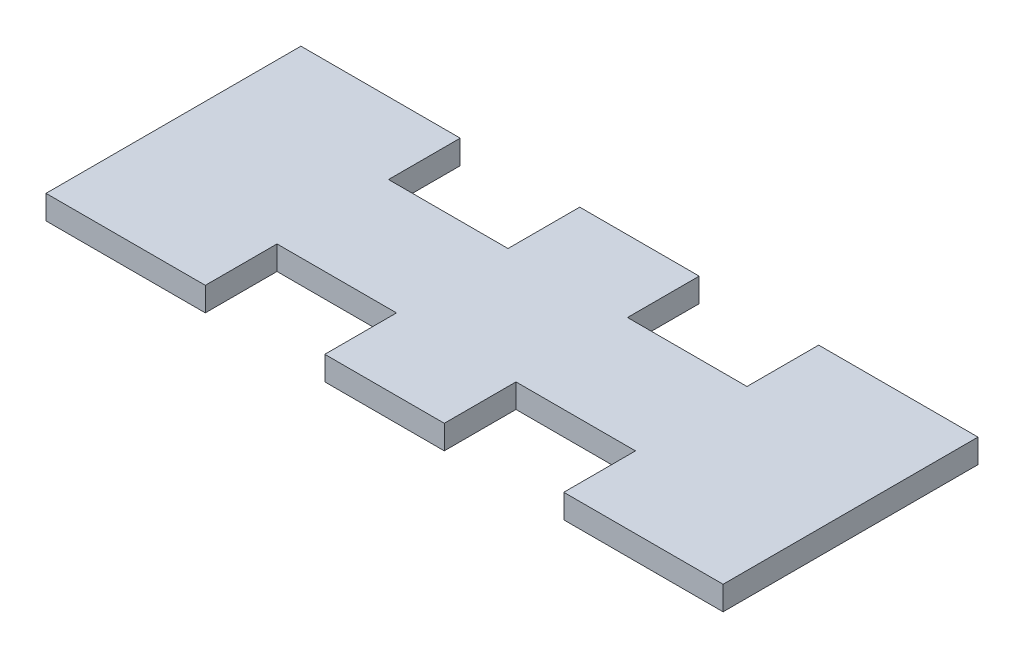
ISO-10303-21;
HEADER;
FILE_DESCRIPTION(('STEP AP214'),'2;1');
FILE_NAME('part.step','',(''),(''),'','','');
FILE_SCHEMA(('AUTOMOTIVE_DESIGN { 1 0 10303 214 1 1 1 1 }'));
ENDSEC;
DATA;
#1=APPLICATION_CONTEXT('core data for automotive mechanical design processes');
#2=APPLICATION_PROTOCOL_DEFINITION('international standard','automotive_design',2000,#1);
#3=PRODUCT_CONTEXT('',#1,'mechanical');
#4=PRODUCT('Part','Part','',(#3));
#5=PRODUCT_RELATED_PRODUCT_CATEGORY('part','',(#4));
#6=PRODUCT_DEFINITION_FORMATION('','',#4);
#7=PRODUCT_DEFINITION_CONTEXT('part definition',#1,'design');
#8=PRODUCT_DEFINITION('design','',#6,#7);
#9=PRODUCT_DEFINITION_SHAPE('','',#8);
#10=(LENGTH_UNIT() NAMED_UNIT(*) SI_UNIT(.MILLI.,.METRE.));
#11=(NAMED_UNIT(*) PLANE_ANGLE_UNIT() SI_UNIT($,.RADIAN.));
#12=(NAMED_UNIT(*) SI_UNIT($,.STERADIAN.) SOLID_ANGLE_UNIT());
#13=UNCERTAINTY_MEASURE_WITH_UNIT(LENGTH_MEASURE(1.E-05),#10,'distance_accuracy_value','');
#14=(GEOMETRIC_REPRESENTATION_CONTEXT(3) GLOBAL_UNCERTAINTY_ASSIGNED_CONTEXT((#13)) GLOBAL_UNIT_ASSIGNED_CONTEXT((#10,
#11,#12)) REPRESENTATION_CONTEXT('',''));
#15=CARTESIAN_POINT('',(0.,0.,0.));
#16=DIRECTION('',(0.,0.,1.));
#17=DIRECTION('',(1.,0.,0.));
#18=AXIS2_PLACEMENT_3D('',#15,#16,#17);
#19=CARTESIAN_POINT('',(0.,3.,0.));
#20=DIRECTION('',(1.,0.,0.));
#21=DIRECTION('',(0.,0.,-1.));
#22=AXIS2_PLACEMENT_3D('',#19,#20,#21);
#23=PLANE('',#22);
#24=DIRECTION('',(0.,0.,1.));
#25=VECTOR('',#24,1.);
#26=CARTESIAN_POINT('',(0.,0.,0.));
#27=LINE('',#26,#25);
#28=CARTESIAN_POINT('',(0.,0.,-32.));
#29=VERTEX_POINT('',#28);
#30=CARTESIAN_POINT('',(0.,0.,0.));
#31=VERTEX_POINT('',#30);
#32=EDGE_CURVE('E201',#29,#31,#27,.T.);
#33=ORIENTED_EDGE('',*,*,#32,.T.);
#34=DIRECTION('',(0.,-1.,0.));
#35=VECTOR('',#34,1.);
#36=CARTESIAN_POINT('',(0.,3.,0.));
#37=LINE('',#36,#35);
#38=CARTESIAN_POINT('',(0.,3.,0.));
#39=VERTEX_POINT('',#38);
#40=EDGE_CURVE('E11',#39,#31,#37,.T.);
#41=ORIENTED_EDGE('',*,*,#40,.F.);
#42=DIRECTION('',(0.,0.,1.));
#43=VECTOR('',#42,1.);
#44=CARTESIAN_POINT('',(0.,3.,0.));
#45=LINE('',#44,#43);
#46=CARTESIAN_POINT('',(0.,3.,-32.));
#47=VERTEX_POINT('',#46);
#48=EDGE_CURVE('E239',#47,#39,#45,.T.);
#49=ORIENTED_EDGE('',*,*,#48,.F.);
#50=DIRECTION('',(0.,-1.,0.));
#51=VECTOR('',#50,1.);
#52=CARTESIAN_POINT('',(0.,3.,-32.));
#53=LINE('',#52,#51);
#54=EDGE_CURVE('E197',#47,#29,#53,.T.);
#55=ORIENTED_EDGE('',*,*,#54,.T.);
#56=EDGE_LOOP('',(#33,#41,#49,#55));
#57=FACE_BOUND('',#56,.T.);
#58=ADVANCED_FACE('F33',(#57),#23,.F.);
#59=CARTESIAN_POINT('',(0.,3.,0.));
#60=DIRECTION('',(0.,0.,-1.));
#61=DIRECTION('',(-1.,0.,0.));
#62=AXIS2_PLACEMENT_3D('',#59,#60,#61);
#63=PLANE('',#62);
#64=DIRECTION('',(1.,0.,0.));
#65=VECTOR('',#64,1.);
#66=CARTESIAN_POINT('',(0.,0.,0.));
#67=LINE('',#66,#65);
#68=CARTESIAN_POINT('',(20.,0.,0.));
#69=VERTEX_POINT('',#68);
#70=EDGE_CURVE('E204',#31,#69,#67,.T.);
#71=ORIENTED_EDGE('',*,*,#70,.T.);
#72=DIRECTION('',(0.,-1.,0.));
#73=VECTOR('',#72,1.);
#74=CARTESIAN_POINT('',(20.,3.,0.));
#75=LINE('',#74,#73);
#76=CARTESIAN_POINT('',(20.,3.,0.));
#77=VERTEX_POINT('',#76);
#78=EDGE_CURVE('E41',#77,#69,#75,.T.);
#79=ORIENTED_EDGE('',*,*,#78,.F.);
#80=DIRECTION('',(1.,0.,0.));
#81=VECTOR('',#80,1.);
#82=CARTESIAN_POINT('',(0.,3.,0.));
#83=LINE('',#82,#81);
#84=EDGE_CURVE('E128',#39,#77,#83,.T.);
#85=ORIENTED_EDGE('',*,*,#84,.F.);
#86=ORIENTED_EDGE('',*,*,#40,.T.);
#87=EDGE_LOOP('',(#71,#79,#85,#86));
#88=FACE_BOUND('',#87,.T.);
#89=ADVANCED_FACE('F357',(#88),#63,.F.);
#90=CARTESIAN_POINT('',(20.,3.,0.));
#91=DIRECTION('',(-1.,0.,0.));
#92=DIRECTION('',(0.,0.,1.));
#93=AXIS2_PLACEMENT_3D('',#90,#91,#92);
#94=PLANE('',#93);
#95=DIRECTION('',(0.,0.,-1.));
#96=VECTOR('',#95,1.);
#97=CARTESIAN_POINT('',(20.,0.,0.));
#98=LINE('',#97,#96);
#99=CARTESIAN_POINT('',(20.,0.,-9.));
#100=VERTEX_POINT('',#99);
#101=EDGE_CURVE('E206',#69,#100,#98,.T.);
#102=ORIENTED_EDGE('',*,*,#101,.T.);
#103=DIRECTION('',(0.,-1.,0.));
#104=VECTOR('',#103,1.);
#105=CARTESIAN_POINT('',(20.,3.,-9.));
#106=LINE('',#105,#104);
#107=CARTESIAN_POINT('',(20.,3.,-9.));
#108=VERTEX_POINT('',#107);
#109=EDGE_CURVE('E282',#108,#100,#106,.T.);
#110=ORIENTED_EDGE('',*,*,#109,.F.);
#111=DIRECTION('',(0.,0.,-1.));
#112=VECTOR('',#111,1.);
#113=CARTESIAN_POINT('',(20.,3.,0.));
#114=LINE('',#113,#112);
#115=EDGE_CURVE('E290',#77,#108,#114,.T.);
#116=ORIENTED_EDGE('',*,*,#115,.F.);
#117=ORIENTED_EDGE('',*,*,#78,.T.);
#118=EDGE_LOOP('',(#102,#110,#116,#117));
#119=FACE_BOUND('',#118,.T.);
#120=ADVANCED_FACE('F288',(#119),#94,.F.);
#121=CARTESIAN_POINT('',(20.,3.,-9.));
#122=DIRECTION('',(0.,0.,-1.));
#123=DIRECTION('',(-1.,0.,0.));
#124=AXIS2_PLACEMENT_3D('',#121,#122,#123);
#125=PLANE('',#124);
#126=DIRECTION('',(1.,0.,0.));
#127=VECTOR('',#126,1.);
#128=CARTESIAN_POINT('',(20.,0.,-9.));
#129=LINE('',#128,#127);
#130=CARTESIAN_POINT('',(35.,0.,-9.));
#131=VERTEX_POINT('',#130);
#132=EDGE_CURVE('E208',#100,#131,#129,.T.);
#133=ORIENTED_EDGE('',*,*,#132,.T.);
#134=DIRECTION('',(0.,-1.,0.));
#135=VECTOR('',#134,1.);
#136=CARTESIAN_POINT('',(35.,3.,-9.));
#137=LINE('',#136,#135);
#138=CARTESIAN_POINT('',(35.,3.,-9.));
#139=VERTEX_POINT('',#138);
#140=EDGE_CURVE('E279',#139,#131,#137,.T.);
#141=ORIENTED_EDGE('',*,*,#140,.F.);
#142=DIRECTION('',(1.,0.,0.));
#143=VECTOR('',#142,1.);
#144=CARTESIAN_POINT('',(20.,3.,-9.));
#145=LINE('',#144,#143);
#146=EDGE_CURVE('E308',#108,#139,#145,.T.);
#147=ORIENTED_EDGE('',*,*,#146,.F.);
#148=ORIENTED_EDGE('',*,*,#109,.T.);
#149=EDGE_LOOP('',(#133,#141,#147,#148));
#150=FACE_BOUND('',#149,.T.);
#151=ADVANCED_FACE('F299',(#150),#125,.F.);
#152=CARTESIAN_POINT('',(35.,3.,-9.));
#153=DIRECTION('',(1.,0.,0.));
#154=DIRECTION('',(0.,0.,-1.));
#155=AXIS2_PLACEMENT_3D('',#152,#153,#154);
#156=PLANE('',#155);
#157=DIRECTION('',(0.,0.,1.));
#158=VECTOR('',#157,1.);
#159=CARTESIAN_POINT('',(35.,0.,-9.));
#160=LINE('',#159,#158);
#161=CARTESIAN_POINT('',(35.,0.,0.));
#162=VERTEX_POINT('',#161);
#163=EDGE_CURVE('E210',#131,#162,#160,.T.);
#164=ORIENTED_EDGE('',*,*,#163,.T.);
#165=DIRECTION('',(0.,-1.,0.));
#166=VECTOR('',#165,1.);
#167=CARTESIAN_POINT('',(35.,3.,0.));
#168=LINE('',#167,#166);
#169=CARTESIAN_POINT('',(35.,3.,0.));
#170=VERTEX_POINT('',#169);
#171=EDGE_CURVE('E276',#170,#162,#168,.T.);
#172=ORIENTED_EDGE('',*,*,#171,.F.);
#173=DIRECTION('',(0.,0.,1.));
#174=VECTOR('',#173,1.);
#175=CARTESIAN_POINT('',(35.,3.,-9.));
#176=LINE('',#175,#174);
#177=EDGE_CURVE('E305',#139,#170,#176,.T.);
#178=ORIENTED_EDGE('',*,*,#177,.F.);
#179=ORIENTED_EDGE('',*,*,#140,.T.);
#180=EDGE_LOOP('',(#164,#172,#178,#179));
#181=FACE_BOUND('',#180,.T.);
#182=ADVANCED_FACE('F303',(#181),#156,.F.);
#183=CARTESIAN_POINT('',(35.,3.,0.));
#184=DIRECTION('',(0.,0.,-1.));
#185=DIRECTION('',(-1.,0.,0.));
#186=AXIS2_PLACEMENT_3D('',#183,#184,#185);
#187=PLANE('',#186);
#188=DIRECTION('',(1.,0.,0.));
#189=VECTOR('',#188,1.);
#190=CARTESIAN_POINT('',(35.,0.,0.));
#191=LINE('',#190,#189);
#192=CARTESIAN_POINT('',(50.,0.,0.));
#193=VERTEX_POINT('',#192);
#194=EDGE_CURVE('E212',#162,#193,#191,.T.);
#195=ORIENTED_EDGE('',*,*,#194,.T.);
#196=DIRECTION('',(0.,-1.,0.));
#197=VECTOR('',#196,1.);
#198=CARTESIAN_POINT('',(50.,3.,0.));
#199=LINE('',#198,#197);
#200=CARTESIAN_POINT('',(50.,3.,0.));
#201=VERTEX_POINT('',#200);
#202=EDGE_CURVE('E273',#201,#193,#199,.T.);
#203=ORIENTED_EDGE('',*,*,#202,.F.);
#204=DIRECTION('',(1.,0.,0.));
#205=VECTOR('',#204,1.);
#206=CARTESIAN_POINT('',(35.,3.,0.));
#207=LINE('',#206,#205);
#208=EDGE_CURVE('E307',#170,#201,#207,.T.);
#209=ORIENTED_EDGE('',*,*,#208,.F.);
#210=ORIENTED_EDGE('',*,*,#171,.T.);
#211=EDGE_LOOP('',(#195,#203,#209,#210));
#212=FACE_BOUND('',#211,.T.);
#213=ADVANCED_FACE('F370',(#212),#187,.F.);
#214=CARTESIAN_POINT('',(50.,3.,-9.));
#215=DIRECTION('',(-1.,0.,0.));
#216=DIRECTION('',(0.,0.,1.));
#217=AXIS2_PLACEMENT_3D('',#214,#215,#216);
#218=PLANE('',#217);
#219=DIRECTION('',(0.,0.,-1.));
#220=VECTOR('',#219,1.);
#221=CARTESIAN_POINT('',(50.,0.,-9.));
#222=LINE('',#221,#220);
#223=CARTESIAN_POINT('',(50.,0.,-9.));
#224=VERTEX_POINT('',#223);
#225=EDGE_CURVE('E214',#193,#224,#222,.T.);
#226=ORIENTED_EDGE('',*,*,#225,.T.);
#227=DIRECTION('',(0.,-1.,0.));
#228=VECTOR('',#227,1.);
#229=CARTESIAN_POINT('',(50.,3.,-9.));
#230=LINE('',#229,#228);
#231=CARTESIAN_POINT('',(50.,3.,-9.));
#232=VERTEX_POINT('',#231);
#233=EDGE_CURVE('E270',#232,#224,#230,.T.);
#234=ORIENTED_EDGE('',*,*,#233,.F.);
#235=DIRECTION('',(0.,0.,-1.));
#236=VECTOR('',#235,1.);
#237=CARTESIAN_POINT('',(50.,3.,-9.));
#238=LINE('',#237,#236);
#239=EDGE_CURVE('E310',#201,#232,#238,.T.);
#240=ORIENTED_EDGE('',*,*,#239,.F.);
#241=ORIENTED_EDGE('',*,*,#202,.T.);
#242=EDGE_LOOP('',(#226,#234,#240,#241));
#243=FACE_BOUND('',#242,.T.);
#244=ADVANCED_FACE('F373',(#243),#218,.F.);
#245=CARTESIAN_POINT('',(65.,3.,-9.));
#246=DIRECTION('',(0.,0.,-1.));
#247=DIRECTION('',(-1.,0.,0.));
#248=AXIS2_PLACEMENT_3D('',#245,#246,#247);
#249=PLANE('',#248);
#250=DIRECTION('',(1.,0.,0.));
#251=VECTOR('',#250,1.);
#252=CARTESIAN_POINT('',(65.,0.,-9.));
#253=LINE('',#252,#251);
#254=CARTESIAN_POINT('',(65.,0.,-9.));
#255=VERTEX_POINT('',#254);
#256=EDGE_CURVE('E216',#224,#255,#253,.T.);
#257=ORIENTED_EDGE('',*,*,#256,.T.);
#258=DIRECTION('',(0.,-1.,0.));
#259=VECTOR('',#258,1.);
#260=CARTESIAN_POINT('',(65.,3.,-9.));
#261=LINE('',#260,#259);
#262=CARTESIAN_POINT('',(65.,3.,-9.));
#263=VERTEX_POINT('',#262);
#264=EDGE_CURVE('E267',#263,#255,#261,.T.);
#265=ORIENTED_EDGE('',*,*,#264,.F.);
#266=DIRECTION('',(1.,0.,0.));
#267=VECTOR('',#266,1.);
#268=CARTESIAN_POINT('',(65.,3.,-9.));
#269=LINE('',#268,#267);
#270=EDGE_CURVE('E316',#232,#263,#269,.T.);
#271=ORIENTED_EDGE('',*,*,#270,.F.);
#272=ORIENTED_EDGE('',*,*,#233,.T.);
#273=EDGE_LOOP('',(#257,#265,#271,#272));
#274=FACE_BOUND('',#273,.T.);
#275=ADVANCED_FACE('F377',(#274),#249,.F.);
#276=CARTESIAN_POINT('',(65.,3.,0.));
#277=DIRECTION('',(1.,0.,0.));
#278=DIRECTION('',(0.,0.,-1.));
#279=AXIS2_PLACEMENT_3D('',#276,#277,#278);
#280=PLANE('',#279);
#281=DIRECTION('',(0.,0.,1.));
#282=VECTOR('',#281,1.);
#283=CARTESIAN_POINT('',(65.,0.,0.));
#284=LINE('',#283,#282);
#285=CARTESIAN_POINT('',(65.,0.,0.));
#286=VERTEX_POINT('',#285);
#287=EDGE_CURVE('E218',#255,#286,#284,.T.);
#288=ORIENTED_EDGE('',*,*,#287,.T.);
#289=DIRECTION('',(0.,-1.,0.));
#290=VECTOR('',#289,1.);
#291=CARTESIAN_POINT('',(65.,3.,0.));
#292=LINE('',#291,#290);
#293=CARTESIAN_POINT('',(65.,3.,0.));
#294=VERTEX_POINT('',#293);
#295=EDGE_CURVE('E264',#294,#286,#292,.T.);
#296=ORIENTED_EDGE('',*,*,#295,.F.);
#297=DIRECTION('',(0.,0.,1.));
#298=VECTOR('',#297,1.);
#299=CARTESIAN_POINT('',(65.,3.,0.));
#300=LINE('',#299,#298);
#301=EDGE_CURVE('E318',#263,#294,#300,.T.);
#302=ORIENTED_EDGE('',*,*,#301,.F.);
#303=ORIENTED_EDGE('',*,*,#264,.T.);
#304=EDGE_LOOP('',(#288,#296,#302,#303));
#305=FACE_BOUND('',#304,.T.);
#306=ADVANCED_FACE('F381',(#305),#280,.F.);
#307=CARTESIAN_POINT('',(85.,3.,0.));
#308=DIRECTION('',(0.,0.,-1.));
#309=DIRECTION('',(-1.,0.,0.));
#310=AXIS2_PLACEMENT_3D('',#307,#308,#309);
#311=PLANE('',#310);
#312=DIRECTION('',(1.,0.,0.));
#313=VECTOR('',#312,1.);
#314=CARTESIAN_POINT('',(85.,0.,0.));
#315=LINE('',#314,#313);
#316=CARTESIAN_POINT('',(85.,0.,0.));
#317=VERTEX_POINT('',#316);
#318=EDGE_CURVE('E220',#286,#317,#315,.T.);
#319=ORIENTED_EDGE('',*,*,#318,.T.);
#320=DIRECTION('',(0.,-1.,0.));
#321=VECTOR('',#320,1.);
#322=CARTESIAN_POINT('',(85.,3.,0.));
#323=LINE('',#322,#321);
#324=CARTESIAN_POINT('',(85.,3.,0.));
#325=VERTEX_POINT('',#324);
#326=EDGE_CURVE('E261',#325,#317,#323,.T.);
#327=ORIENTED_EDGE('',*,*,#326,.F.);
#328=DIRECTION('',(1.,0.,0.));
#329=VECTOR('',#328,1.);
#330=CARTESIAN_POINT('',(85.,3.,0.));
#331=LINE('',#330,#329);
#332=EDGE_CURVE('E320',#294,#325,#331,.T.);
#333=ORIENTED_EDGE('',*,*,#332,.F.);
#334=ORIENTED_EDGE('',*,*,#295,.T.);
#335=EDGE_LOOP('',(#319,#327,#333,#334));
#336=FACE_BOUND('',#335,.T.);
#337=ADVANCED_FACE('F385',(#336),#311,.F.);
#338=CARTESIAN_POINT('',(85.,3.,-32.));
#339=DIRECTION('',(-1.,0.,0.));
#340=DIRECTION('',(0.,0.,1.));
#341=AXIS2_PLACEMENT_3D('',#338,#339,#340);
#342=PLANE('',#341);
#343=DIRECTION('',(0.,0.,-1.));
#344=VECTOR('',#343,1.);
#345=CARTESIAN_POINT('',(85.,0.,-32.));
#346=LINE('',#345,#344);
#347=CARTESIAN_POINT('',(85.,0.,-32.));
#348=VERTEX_POINT('',#347);
#349=EDGE_CURVE('E222',#317,#348,#346,.T.);
#350=ORIENTED_EDGE('',*,*,#349,.T.);
#351=DIRECTION('',(0.,-1.,0.));
#352=VECTOR('',#351,1.);
#353=CARTESIAN_POINT('',(85.,3.,-32.));
#354=LINE('',#353,#352);
#355=CARTESIAN_POINT('',(85.,3.,-32.));
#356=VERTEX_POINT('',#355);
#357=EDGE_CURVE('E258',#356,#348,#354,.T.);
#358=ORIENTED_EDGE('',*,*,#357,.F.);
#359=DIRECTION('',(0.,0.,-1.));
#360=VECTOR('',#359,1.);
#361=CARTESIAN_POINT('',(85.,3.,-32.));
#362=LINE('',#361,#360);
#363=EDGE_CURVE('E322',#325,#356,#362,.T.);
#364=ORIENTED_EDGE('',*,*,#363,.F.);
#365=ORIENTED_EDGE('',*,*,#326,.T.);
#366=EDGE_LOOP('',(#350,#358,#364,#365));
#367=FACE_BOUND('',#366,.T.);
#368=ADVANCED_FACE('F389',(#367),#342,.F.);
#369=CARTESIAN_POINT('',(65.,3.,-32.));
#370=DIRECTION('',(0.,0.,1.));
#371=DIRECTION('',(1.,0.,0.));
#372=AXIS2_PLACEMENT_3D('',#369,#370,#371);
#373=PLANE('',#372);
#374=DIRECTION('',(-1.,0.,0.));
#375=VECTOR('',#374,1.);
#376=CARTESIAN_POINT('',(65.,0.,-32.));
#377=LINE('',#376,#375);
#378=CARTESIAN_POINT('',(65.,0.,-32.));
#379=VERTEX_POINT('',#378);
#380=EDGE_CURVE('E224',#348,#379,#377,.T.);
#381=ORIENTED_EDGE('',*,*,#380,.T.);
#382=DIRECTION('',(0.,-1.,0.));
#383=VECTOR('',#382,1.);
#384=CARTESIAN_POINT('',(65.,3.,-32.));
#385=LINE('',#384,#383);
#386=CARTESIAN_POINT('',(65.,3.,-32.));
#387=VERTEX_POINT('',#386);
#388=EDGE_CURVE('E255',#387,#379,#385,.T.);
#389=ORIENTED_EDGE('',*,*,#388,.F.);
#390=DIRECTION('',(-1.,0.,0.));
#391=VECTOR('',#390,1.);
#392=CARTESIAN_POINT('',(65.,3.,-32.));
#393=LINE('',#392,#391);
#394=EDGE_CURVE('E324',#356,#387,#393,.T.);
#395=ORIENTED_EDGE('',*,*,#394,.F.);
#396=ORIENTED_EDGE('',*,*,#357,.T.);
#397=EDGE_LOOP('',(#381,#389,#395,#396));
#398=FACE_BOUND('',#397,.T.);
#399=ADVANCED_FACE('F393',(#398),#373,.F.);
#400=CARTESIAN_POINT('',(65.,3.,-23.));
#401=DIRECTION('',(1.,0.,0.));
#402=DIRECTION('',(0.,0.,-1.));
#403=AXIS2_PLACEMENT_3D('',#400,#401,#402);
#404=PLANE('',#403);
#405=DIRECTION('',(0.,0.,1.));
#406=VECTOR('',#405,1.);
#407=CARTESIAN_POINT('',(65.,0.,-23.));
#408=LINE('',#407,#406);
#409=CARTESIAN_POINT('',(65.,0.,-23.));
#410=VERTEX_POINT('',#409);
#411=EDGE_CURVE('E226',#379,#410,#408,.T.);
#412=ORIENTED_EDGE('',*,*,#411,.T.);
#413=DIRECTION('',(0.,-1.,0.));
#414=VECTOR('',#413,1.);
#415=CARTESIAN_POINT('',(65.,3.,-23.));
#416=LINE('',#415,#414);
#417=CARTESIAN_POINT('',(65.,3.,-23.));
#418=VERTEX_POINT('',#417);
#419=EDGE_CURVE('E252',#418,#410,#416,.T.);
#420=ORIENTED_EDGE('',*,*,#419,.F.);
#421=DIRECTION('',(0.,0.,1.));
#422=VECTOR('',#421,1.);
#423=CARTESIAN_POINT('',(65.,3.,-23.));
#424=LINE('',#423,#422);
#425=EDGE_CURVE('E326',#387,#418,#424,.T.);
#426=ORIENTED_EDGE('',*,*,#425,.F.);
#427=ORIENTED_EDGE('',*,*,#388,.T.);
#428=EDGE_LOOP('',(#412,#420,#426,#427));
#429=FACE_BOUND('',#428,.T.);
#430=ADVANCED_FACE('F397',(#429),#404,.F.);
#431=CARTESIAN_POINT('',(50.,3.,-23.));
#432=DIRECTION('',(0.,0.,1.));
#433=DIRECTION('',(1.,0.,0.));
#434=AXIS2_PLACEMENT_3D('',#431,#432,#433);
#435=PLANE('',#434);
#436=DIRECTION('',(-1.,0.,0.));
#437=VECTOR('',#436,1.);
#438=CARTESIAN_POINT('',(50.,0.,-23.));
#439=LINE('',#438,#437);
#440=CARTESIAN_POINT('',(50.,0.,-23.));
#441=VERTEX_POINT('',#440);
#442=EDGE_CURVE('E228',#410,#441,#439,.T.);
#443=ORIENTED_EDGE('',*,*,#442,.T.);
#444=DIRECTION('',(0.,-1.,0.));
#445=VECTOR('',#444,1.);
#446=CARTESIAN_POINT('',(50.,3.,-23.));
#447=LINE('',#446,#445);
#448=CARTESIAN_POINT('',(50.,3.,-23.));
#449=VERTEX_POINT('',#448);
#450=EDGE_CURVE('E249',#449,#441,#447,.T.);
#451=ORIENTED_EDGE('',*,*,#450,.F.);
#452=DIRECTION('',(-1.,0.,0.));
#453=VECTOR('',#452,1.);
#454=CARTESIAN_POINT('',(50.,3.,-23.));
#455=LINE('',#454,#453);
#456=EDGE_CURVE('E328',#418,#449,#455,.T.);
#457=ORIENTED_EDGE('',*,*,#456,.F.);
#458=ORIENTED_EDGE('',*,*,#419,.T.);
#459=EDGE_LOOP('',(#443,#451,#457,#458));
#460=FACE_BOUND('',#459,.T.);
#461=ADVANCED_FACE('F401',(#460),#435,.F.);
#462=CARTESIAN_POINT('',(50.,3.,-32.));
#463=DIRECTION('',(-1.,0.,0.));
#464=DIRECTION('',(0.,0.,1.));
#465=AXIS2_PLACEMENT_3D('',#462,#463,#464);
#466=PLANE('',#465);
#467=DIRECTION('',(0.,0.,-1.));
#468=VECTOR('',#467,1.);
#469=CARTESIAN_POINT('',(50.,0.,-32.));
#470=LINE('',#469,#468);
#471=CARTESIAN_POINT('',(50.,0.,-32.));
#472=VERTEX_POINT('',#471);
#473=EDGE_CURVE('E230',#441,#472,#470,.T.);
#474=ORIENTED_EDGE('',*,*,#473,.T.);
#475=DIRECTION('',(0.,-1.,0.));
#476=VECTOR('',#475,1.);
#477=CARTESIAN_POINT('',(50.,3.,-32.));
#478=LINE('',#477,#476);
#479=CARTESIAN_POINT('',(50.,3.,-32.));
#480=VERTEX_POINT('',#479);
#481=EDGE_CURVE('E246',#480,#472,#478,.T.);
#482=ORIENTED_EDGE('',*,*,#481,.F.);
#483=DIRECTION('',(0.,0.,-1.));
#484=VECTOR('',#483,1.);
#485=CARTESIAN_POINT('',(50.,3.,-32.));
#486=LINE('',#485,#484);
#487=EDGE_CURVE('E330',#449,#480,#486,.T.);
#488=ORIENTED_EDGE('',*,*,#487,.F.);
#489=ORIENTED_EDGE('',*,*,#450,.T.);
#490=EDGE_LOOP('',(#474,#482,#488,#489));
#491=FACE_BOUND('',#490,.T.);
#492=ADVANCED_FACE('F405',(#491),#466,.F.);
#493=CARTESIAN_POINT('',(35.,3.,-32.));
#494=DIRECTION('',(0.,0.,1.));
#495=DIRECTION('',(1.,0.,0.));
#496=AXIS2_PLACEMENT_3D('',#493,#494,#495);
#497=PLANE('',#496);
#498=DIRECTION('',(-1.,0.,0.));
#499=VECTOR('',#498,1.);
#500=CARTESIAN_POINT('',(35.,0.,-32.));
#501=LINE('',#500,#499);
#502=CARTESIAN_POINT('',(35.,0.,-32.));
#503=VERTEX_POINT('',#502);
#504=EDGE_CURVE('E232',#472,#503,#501,.T.);
#505=ORIENTED_EDGE('',*,*,#504,.T.);
#506=DIRECTION('',(0.,-1.,0.));
#507=VECTOR('',#506,1.);
#508=CARTESIAN_POINT('',(35.,3.,-32.));
#509=LINE('',#508,#507);
#510=CARTESIAN_POINT('',(35.,3.,-32.));
#511=VERTEX_POINT('',#510);
#512=EDGE_CURVE('E243',#511,#503,#509,.T.);
#513=ORIENTED_EDGE('',*,*,#512,.F.);
#514=DIRECTION('',(-1.,0.,0.));
#515=VECTOR('',#514,1.);
#516=CARTESIAN_POINT('',(35.,3.,-32.));
#517=LINE('',#516,#515);
#518=EDGE_CURVE('E332',#480,#511,#517,.T.);
#519=ORIENTED_EDGE('',*,*,#518,.F.);
#520=ORIENTED_EDGE('',*,*,#481,.T.);
#521=EDGE_LOOP('',(#505,#513,#519,#520));
#522=FACE_BOUND('',#521,.T.);
#523=ADVANCED_FACE('F338',(#522),#497,.F.);
#524=CARTESIAN_POINT('',(35.,3.,-23.));
#525=DIRECTION('',(1.,0.,0.));
#526=DIRECTION('',(0.,0.,-1.));
#527=AXIS2_PLACEMENT_3D('',#524,#525,#526);
#528=PLANE('',#527);
#529=DIRECTION('',(0.,0.,1.));
#530=VECTOR('',#529,1.);
#531=CARTESIAN_POINT('',(35.,0.,-23.));
#532=LINE('',#531,#530);
#533=CARTESIAN_POINT('',(35.,0.,-23.));
#534=VERTEX_POINT('',#533);
#535=EDGE_CURVE('E234',#503,#534,#532,.T.);
#536=ORIENTED_EDGE('',*,*,#535,.T.);
#537=DIRECTION('',(0.,-1.,0.));
#538=VECTOR('',#537,1.);
#539=CARTESIAN_POINT('',(35.,3.,-23.));
#540=LINE('',#539,#538);
#541=CARTESIAN_POINT('',(35.,3.,-23.));
#542=VERTEX_POINT('',#541);
#543=EDGE_CURVE('E192',#542,#534,#540,.T.);
#544=ORIENTED_EDGE('',*,*,#543,.F.);
#545=DIRECTION('',(0.,0.,1.));
#546=VECTOR('',#545,1.);
#547=CARTESIAN_POINT('',(35.,3.,-23.));
#548=LINE('',#547,#546);
#549=EDGE_CURVE('E183',#511,#542,#548,.T.);
#550=ORIENTED_EDGE('',*,*,#549,.F.);
#551=ORIENTED_EDGE('',*,*,#512,.T.);
#552=EDGE_LOOP('',(#536,#544,#550,#551));
#553=FACE_BOUND('',#552,.T.);
#554=ADVANCED_FACE('F342',(#553),#528,.F.);
#555=CARTESIAN_POINT('',(20.,3.,-23.));
#556=DIRECTION('',(0.,0.,1.));
#557=DIRECTION('',(1.,0.,0.));
#558=AXIS2_PLACEMENT_3D('',#555,#556,#557);
#559=PLANE('',#558);
#560=DIRECTION('',(-1.,0.,0.));
#561=VECTOR('',#560,1.);
#562=CARTESIAN_POINT('',(20.,0.,-23.));
#563=LINE('',#562,#561);
#564=CARTESIAN_POINT('',(20.,0.,-23.));
#565=VERTEX_POINT('',#564);
#566=EDGE_CURVE('E191',#534,#565,#563,.T.);
#567=ORIENTED_EDGE('',*,*,#566,.T.);
#568=DIRECTION('',(0.,-1.,0.));
#569=VECTOR('',#568,1.);
#570=CARTESIAN_POINT('',(20.,3.,-23.));
#571=LINE('',#570,#569);
#572=CARTESIAN_POINT('',(20.,3.,-23.));
#573=VERTEX_POINT('',#572);
#574=EDGE_CURVE('E188',#573,#565,#571,.T.);
#575=ORIENTED_EDGE('',*,*,#574,.F.);
#576=DIRECTION('',(-1.,0.,0.));
#577=VECTOR('',#576,1.);
#578=CARTESIAN_POINT('',(20.,3.,-23.));
#579=LINE('',#578,#577);
#580=EDGE_CURVE('E177',#542,#573,#579,.T.);
#581=ORIENTED_EDGE('',*,*,#580,.F.);
#582=ORIENTED_EDGE('',*,*,#543,.T.);
#583=EDGE_LOOP('',(#567,#575,#581,#582));
#584=FACE_BOUND('',#583,.T.);
#585=ADVANCED_FACE('F189',(#584),#559,.F.);
#586=CARTESIAN_POINT('',(20.,3.,-32.));
#587=DIRECTION('',(-1.,0.,0.));
#588=DIRECTION('',(0.,0.,1.));
#589=AXIS2_PLACEMENT_3D('',#586,#587,#588);
#590=PLANE('',#589);
#591=DIRECTION('',(0.,0.,-1.));
#592=VECTOR('',#591,1.);
#593=CARTESIAN_POINT('',(20.,0.,-32.));
#594=LINE('',#593,#592);
#595=CARTESIAN_POINT('',(20.,0.,-32.));
#596=VERTEX_POINT('',#595);
#597=EDGE_CURVE('E114',#565,#596,#594,.T.);
#598=ORIENTED_EDGE('',*,*,#597,.T.);
#599=DIRECTION('',(0.,-1.,0.));
#600=VECTOR('',#599,1.);
#601=CARTESIAN_POINT('',(20.,3.,-32.));
#602=LINE('',#601,#600);
#603=CARTESIAN_POINT('',(20.,3.,-32.));
#604=VERTEX_POINT('',#603);
#605=EDGE_CURVE('E193',#604,#596,#602,.T.);
#606=ORIENTED_EDGE('',*,*,#605,.F.);
#607=DIRECTION('',(0.,0.,-1.));
#608=VECTOR('',#607,1.);
#609=CARTESIAN_POINT('',(20.,3.,-32.));
#610=LINE('',#609,#608);
#611=EDGE_CURVE('E181',#573,#604,#610,.T.);
#612=ORIENTED_EDGE('',*,*,#611,.F.);
#613=ORIENTED_EDGE('',*,*,#574,.T.);
#614=EDGE_LOOP('',(#598,#606,#612,#613));
#615=FACE_BOUND('',#614,.T.);
#616=ADVANCED_FACE('F195',(#615),#590,.F.);
#617=CARTESIAN_POINT('',(0.,3.,-32.));
#618=DIRECTION('',(0.,0.,1.));
#619=DIRECTION('',(1.,0.,0.));
#620=AXIS2_PLACEMENT_3D('',#617,#618,#619);
#621=PLANE('',#620);
#622=DIRECTION('',(-1.,0.,0.));
#623=VECTOR('',#622,1.);
#624=CARTESIAN_POINT('',(0.,0.,-32.));
#625=LINE('',#624,#623);
#626=EDGE_CURVE('E120',#596,#29,#625,.T.);
#627=ORIENTED_EDGE('',*,*,#626,.T.);
#628=ORIENTED_EDGE('',*,*,#54,.F.);
#629=DIRECTION('',(-1.,0.,0.));
#630=VECTOR('',#629,1.);
#631=CARTESIAN_POINT('',(0.,3.,-32.));
#632=LINE('',#631,#630);
#633=EDGE_CURVE('E49',#604,#47,#632,.T.);
#634=ORIENTED_EDGE('',*,*,#633,.F.);
#635=ORIENTED_EDGE('',*,*,#605,.T.);
#636=EDGE_LOOP('',(#627,#628,#634,#635));
#637=FACE_BOUND('',#636,.T.);
#638=ADVANCED_FACE('F346',(#637),#621,.F.);
#639=CARTESIAN_POINT('',(0.,3.,0.));
#640=DIRECTION('',(0.,-1.,0.));
#641=DIRECTION('',(0.,0.,-1.));
#642=AXIS2_PLACEMENT_3D('',#639,#640,#641);
#643=PLANE('',#642);
#644=ORIENTED_EDGE('',*,*,#48,.T.);
#645=ORIENTED_EDGE('',*,*,#84,.T.);
#646=ORIENTED_EDGE('',*,*,#115,.T.);
#647=ORIENTED_EDGE('',*,*,#146,.T.);
#648=ORIENTED_EDGE('',*,*,#177,.T.);
#649=ORIENTED_EDGE('',*,*,#208,.T.);
#650=ORIENTED_EDGE('',*,*,#239,.T.);
#651=ORIENTED_EDGE('',*,*,#270,.T.);
#652=ORIENTED_EDGE('',*,*,#301,.T.);
#653=ORIENTED_EDGE('',*,*,#332,.T.);
#654=ORIENTED_EDGE('',*,*,#363,.T.);
#655=ORIENTED_EDGE('',*,*,#394,.T.);
#656=ORIENTED_EDGE('',*,*,#425,.T.);
#657=ORIENTED_EDGE('',*,*,#456,.T.);
#658=ORIENTED_EDGE('',*,*,#487,.T.);
#659=ORIENTED_EDGE('',*,*,#518,.T.);
#660=ORIENTED_EDGE('',*,*,#549,.T.);
#661=ORIENTED_EDGE('',*,*,#580,.T.);
#662=ORIENTED_EDGE('',*,*,#611,.T.);
#663=ORIENTED_EDGE('',*,*,#633,.T.);
#664=EDGE_LOOP('',(#644,#645,#646,#647,#648,#649,#650,#651,#652,#653,#654,#655,#656,#657,#658,
#659,#660,#661,#662,#663));
#665=FACE_BOUND('',#664,.T.);
#666=ADVANCED_FACE('F179',(#665),#643,.F.);
#667=CARTESIAN_POINT('',(0.,0.,0.));
#668=DIRECTION('',(0.,-1.,0.));
#669=DIRECTION('',(0.,0.,-1.));
#670=AXIS2_PLACEMENT_3D('',#667,#668,#669);
#671=PLANE('',#670);
#672=ORIENTED_EDGE('',*,*,#32,.F.);
#673=ORIENTED_EDGE('',*,*,#626,.F.);
#674=ORIENTED_EDGE('',*,*,#597,.F.);
#675=ORIENTED_EDGE('',*,*,#566,.F.);
#676=ORIENTED_EDGE('',*,*,#535,.F.);
#677=ORIENTED_EDGE('',*,*,#504,.F.);
#678=ORIENTED_EDGE('',*,*,#473,.F.);
#679=ORIENTED_EDGE('',*,*,#442,.F.);
#680=ORIENTED_EDGE('',*,*,#411,.F.);
#681=ORIENTED_EDGE('',*,*,#380,.F.);
#682=ORIENTED_EDGE('',*,*,#349,.F.);
#683=ORIENTED_EDGE('',*,*,#318,.F.);
#684=ORIENTED_EDGE('',*,*,#287,.F.);
#685=ORIENTED_EDGE('',*,*,#256,.F.);
#686=ORIENTED_EDGE('',*,*,#225,.F.);
#687=ORIENTED_EDGE('',*,*,#194,.F.);
#688=ORIENTED_EDGE('',*,*,#163,.F.);
#689=ORIENTED_EDGE('',*,*,#132,.F.);
#690=ORIENTED_EDGE('',*,*,#101,.F.);
#691=ORIENTED_EDGE('',*,*,#70,.F.);
#692=EDGE_LOOP('',(#672,#673,#674,#675,#676,#677,#678,#679,#680,#681,#682,#683,#684,#685,#686,
#687,#688,#689,#690,#691));
#693=FACE_BOUND('',#692,.T.);
#694=ADVANCED_FACE('F294',(#693),#671,.T.);
#695=CLOSED_SHELL('',(#58,#89,#120,#151,#182,#213,#244,#275,#306,#337,#368,#399,#430,#461,#492,
#523,#554,#585,#616,#638,#666,#694));
#696=MANIFOLD_SOLID_BREP('B2',#695);
#697=ADVANCED_BREP_SHAPE_REPRESENTATION('',(#18,#696),#14);
#698=SHAPE_DEFINITION_REPRESENTATION(#9,#697);
ENDSEC;
END-ISO-10303-21;
